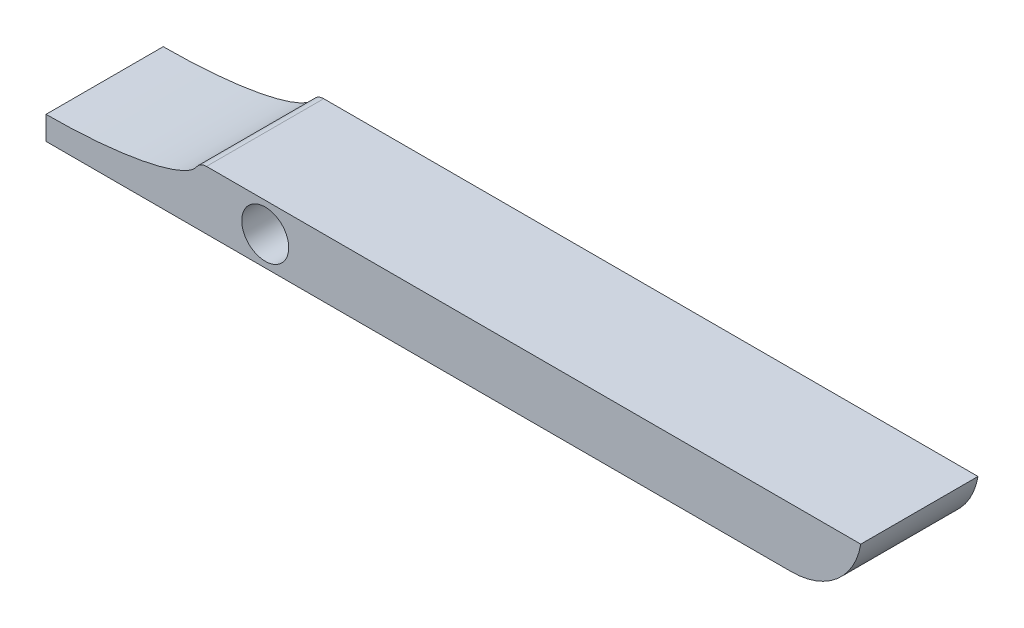
ISO-10303-21;
HEADER;
FILE_DESCRIPTION(('STEP AP214'),'2;1');
FILE_NAME('part.step','',(''),(''),'','','');
FILE_SCHEMA(('AUTOMOTIVE_DESIGN { 1 0 10303 214 1 1 1 1 }'));
ENDSEC;
DATA;
#1=APPLICATION_CONTEXT('core data for automotive mechanical design processes');
#2=APPLICATION_PROTOCOL_DEFINITION('international standard','automotive_design',2000,#1);
#3=PRODUCT_CONTEXT('',#1,'mechanical');
#4=PRODUCT('Part','Part','',(#3));
#5=PRODUCT_RELATED_PRODUCT_CATEGORY('part','',(#4));
#6=PRODUCT_DEFINITION_FORMATION('','',#4);
#7=PRODUCT_DEFINITION_CONTEXT('part definition',#1,'design');
#8=PRODUCT_DEFINITION('design','',#6,#7);
#9=PRODUCT_DEFINITION_SHAPE('','',#8);
#10=(LENGTH_UNIT() NAMED_UNIT(*) SI_UNIT(.MILLI.,.METRE.));
#11=(NAMED_UNIT(*) PLANE_ANGLE_UNIT() SI_UNIT($,.RADIAN.));
#12=(NAMED_UNIT(*) SI_UNIT($,.STERADIAN.) SOLID_ANGLE_UNIT());
#13=UNCERTAINTY_MEASURE_WITH_UNIT(LENGTH_MEASURE(1.E-05),#10,'distance_accuracy_value','');
#14=(GEOMETRIC_REPRESENTATION_CONTEXT(3) GLOBAL_UNCERTAINTY_ASSIGNED_CONTEXT((#13)) GLOBAL_UNIT_ASSIGNED_CONTEXT((#10,
#11,#12)) REPRESENTATION_CONTEXT('',''));
#15=CARTESIAN_POINT('',(0.,0.,0.));
#16=DIRECTION('',(0.,0.,1.));
#17=DIRECTION('',(1.,0.,0.));
#18=AXIS2_PLACEMENT_3D('',#15,#16,#17);
#19=CARTESIAN_POINT('',(-17.375,2.5,2.5));
#20=DIRECTION('',(1.,0.,0.));
#21=DIRECTION('',(0.,0.,-1.));
#22=AXIS2_PLACEMENT_3D('',#19,#20,#21);
#23=PLANE('',#22);
#24=DIRECTION('',(0.,-1.,0.));
#25=VECTOR('',#24,1.);
#26=CARTESIAN_POINT('',(-17.375,2.5,2.5));
#27=LINE('',#26,#25);
#28=CARTESIAN_POINT('',(-17.375,1.,2.5));
#29=VERTEX_POINT('',#28);
#30=CARTESIAN_POINT('',(-17.375,0.,2.5));
#31=VERTEX_POINT('',#30);
#32=EDGE_CURVE('E108',#29,#31,#27,.T.);
#33=ORIENTED_EDGE('',*,*,#32,.F.);
#34=DIRECTION('',(0.,0.,1.));
#35=VECTOR('',#34,1.);
#36=CARTESIAN_POINT('',(-17.375,1.,-7.5));
#37=LINE('',#36,#35);
#38=CARTESIAN_POINT('',(-17.375,1.,-2.5));
#39=VERTEX_POINT('',#38);
#40=EDGE_CURVE('E91',#29,#39,#37,.F.);
#41=ORIENTED_EDGE('',*,*,#40,.T.);
#42=DIRECTION('',(0.,-1.,0.));
#43=VECTOR('',#42,1.);
#44=CARTESIAN_POINT('',(-17.375,2.5,-2.5));
#45=LINE('',#44,#43);
#46=CARTESIAN_POINT('',(-17.375,0.,-2.5));
#47=VERTEX_POINT('',#46);
#48=EDGE_CURVE('E119',#39,#47,#45,.T.);
#49=ORIENTED_EDGE('',*,*,#48,.T.);
#50=DIRECTION('',(0.,0.,1.));
#51=VECTOR('',#50,1.);
#52=CARTESIAN_POINT('',(-17.375,0.,2.5));
#53=LINE('',#52,#51);
#54=EDGE_CURVE('E116',#47,#31,#53,.T.);
#55=ORIENTED_EDGE('',*,*,#54,.T.);
#56=EDGE_LOOP('',(#33,#41,#49,#55));
#57=FACE_BOUND('',#56,.T.);
#58=ADVANCED_FACE('F38',(#57),#23,.F.);
#59=CARTESIAN_POINT('',(17.375,2.5,2.5));
#60=DIRECTION('',(0.,0.,-1.));
#61=DIRECTION('',(-1.,0.,0.));
#62=AXIS2_PLACEMENT_3D('',#59,#60,#61);
#63=PLANE('',#62);
#64=CARTESIAN_POINT('',(-8.02499999999999,1.25,2.5));
#65=DIRECTION('',(0.,0.,1.));
#66=DIRECTION('',(1.,0.,0.));
#67=AXIS2_PLACEMENT_3D('',#64,#65,#66);
#68=CIRCLE('',#67,1.00249999999999);
#69=CARTESIAN_POINT('',(-7.0225,1.25,2.5));
#70=VERTEX_POINT('',#69);
#71=EDGE_CURVE('E104',#70,#70,#68,.T.);
#72=ORIENTED_EDGE('',*,*,#71,.F.);
#73=EDGE_LOOP('',(#72));
#74=FACE_BOUND('',#73,.T.);
#75=DIRECTION('',(1.,0.,0.));
#76=VECTOR('',#75,1.);
#77=CARTESIAN_POINT('',(17.375,0.,2.5));
#78=LINE('',#77,#76);
#79=CARTESIAN_POINT('',(14.4169601084502,0.,2.5));
#80=VERTEX_POINT('',#79);
#81=EDGE_CURVE('E171',#31,#80,#78,.T.);
#82=ORIENTED_EDGE('',*,*,#81,.T.);
#83=CARTESIAN_POINT('',(14.4169601084502,3.,2.5));
#84=DIRECTION('',(0.,0.,-1.));
#85=DIRECTION('',(-1.,0.,0.));
#86=AXIS2_PLACEMENT_3D('',#83,#84,#85);
#87=CIRCLE('',#86,3.);
#88=CARTESIAN_POINT('',(17.375,2.5,2.5));
#89=VERTEX_POINT('',#88);
#90=EDGE_CURVE('E11',#80,#89,#87,.F.);
#91=ORIENTED_EDGE('',*,*,#90,.T.);
#92=DIRECTION('',(1.,0.,0.));
#93=VECTOR('',#92,1.);
#94=CARTESIAN_POINT('',(17.375,2.5,2.5));
#95=LINE('',#94,#93);
#96=CARTESIAN_POINT('',(-10.5309585977544,2.5,2.5));
#97=VERTEX_POINT('',#96);
#98=EDGE_CURVE('E144',#97,#89,#95,.T.);
#99=ORIENTED_EDGE('',*,*,#98,.F.);
#100=CARTESIAN_POINT('',(-10.5309585977544,2.,2.5));
#101=DIRECTION('',(0.,0.,-1.));
#102=DIRECTION('',(-1.,0.,0.));
#103=AXIS2_PLACEMENT_3D('',#100,#101,#102);
#104=CIRCLE('',#103,0.5);
#105=CARTESIAN_POINT('',(-10.9486551771746,2.27482643166319,2.5));
#106=VERTEX_POINT('',#105);
#107=EDGE_CURVE('E111',#97,#106,#104,.F.);
#108=ORIENTED_EDGE('',*,*,#107,.T.);
#109=CARTESIAN_POINT('',(-17.375,2.5,2.5));
#110=DIRECTION('',(0.,0.,1.));
#111=DIRECTION('',(1.,0.,0.));
#112=AXIS2_PLACEMENT_3D('',#109,#110,#111);
#113=ELLIPSE('',#112,6.5,1.5);
#114=EDGE_CURVE('E95',#29,#106,#113,.T.);
#115=ORIENTED_EDGE('',*,*,#114,.F.);
#116=ORIENTED_EDGE('',*,*,#32,.T.);
#117=EDGE_LOOP('',(#82,#91,#99,#108,#115,#116));
#118=FACE_BOUND('',#117,.T.);
#119=ADVANCED_FACE('F107',(#74,#118),#63,.F.);
#120=CARTESIAN_POINT('',(17.375,2.5,-2.5));
#121=DIRECTION('',(0.,0.,1.));
#122=DIRECTION('',(1.,0.,0.));
#123=AXIS2_PLACEMENT_3D('',#120,#121,#122);
#124=PLANE('',#123);
#125=CARTESIAN_POINT('',(-8.02499999999999,1.25,-2.5));
#126=DIRECTION('',(0.,0.,1.));
#127=DIRECTION('',(1.,0.,0.));
#128=AXIS2_PLACEMENT_3D('',#125,#126,#127);
#129=CIRCLE('',#128,1.0025);
#130=CARTESIAN_POINT('',(-7.02249999999999,1.25,-2.5));
#131=VERTEX_POINT('',#130);
#132=EDGE_CURVE('E161',#131,#131,#129,.T.);
#133=ORIENTED_EDGE('',*,*,#132,.T.);
#134=EDGE_LOOP('',(#133));
#135=FACE_BOUND('',#134,.T.);
#136=DIRECTION('',(-1.,0.,0.));
#137=VECTOR('',#136,1.);
#138=CARTESIAN_POINT('',(17.375,2.5,-2.5));
#139=LINE('',#138,#137);
#140=CARTESIAN_POINT('',(17.375,2.5,-2.5));
#141=VERTEX_POINT('',#140);
#142=CARTESIAN_POINT('',(-10.5309585977544,2.5,-2.5));
#143=VERTEX_POINT('',#142);
#144=EDGE_CURVE('E125',#141,#143,#139,.T.);
#145=ORIENTED_EDGE('',*,*,#144,.F.);
#146=CARTESIAN_POINT('',(14.4169601084502,3.,-2.5));
#147=DIRECTION('',(0.,0.,1.));
#148=DIRECTION('',(1.,0.,0.));
#149=AXIS2_PLACEMENT_3D('',#146,#147,#148);
#150=CIRCLE('',#149,3.);
#151=CARTESIAN_POINT('',(14.4169601084502,0.,-2.5));
#152=VERTEX_POINT('',#151);
#153=EDGE_CURVE('E61',#141,#152,#150,.F.);
#154=ORIENTED_EDGE('',*,*,#153,.T.);
#155=DIRECTION('',(-1.,0.,0.));
#156=VECTOR('',#155,1.);
#157=CARTESIAN_POINT('',(17.375,0.,-2.5));
#158=LINE('',#157,#156);
#159=EDGE_CURVE('E150',#152,#47,#158,.T.);
#160=ORIENTED_EDGE('',*,*,#159,.T.);
#161=ORIENTED_EDGE('',*,*,#48,.F.);
#162=CARTESIAN_POINT('',(-17.375,2.5,-2.5));
#163=DIRECTION('',(0.,0.,1.));
#164=DIRECTION('',(1.,0.,0.));
#165=AXIS2_PLACEMENT_3D('',#162,#163,#164);
#166=ELLIPSE('',#165,6.5,1.5);
#167=CARTESIAN_POINT('',(-10.9486551771746,2.27482643166319,-2.5));
#168=VERTEX_POINT('',#167);
#169=EDGE_CURVE('E98',#39,#168,#166,.T.);
#170=ORIENTED_EDGE('',*,*,#169,.T.);
#171=CARTESIAN_POINT('',(-10.5309585977544,2.,-2.5));
#172=DIRECTION('',(0.,0.,1.));
#173=DIRECTION('',(1.,0.,0.));
#174=AXIS2_PLACEMENT_3D('',#171,#172,#173);
#175=CIRCLE('',#174,0.5);
#176=EDGE_CURVE('E123',#168,#143,#175,.F.);
#177=ORIENTED_EDGE('',*,*,#176,.T.);
#178=EDGE_LOOP('',(#145,#154,#160,#161,#170,#177));
#179=FACE_BOUND('',#178,.T.);
#180=ADVANCED_FACE('F153',(#135,#179),#124,.F.);
#181=CARTESIAN_POINT('',(0.,2.5,0.));
#182=DIRECTION('',(0.,1.,0.));
#183=DIRECTION('',(0.,0.,1.));
#184=AXIS2_PLACEMENT_3D('',#181,#182,#183);
#185=PLANE('',#184);
#186=ORIENTED_EDGE('',*,*,#144,.T.);
#187=DIRECTION('',(0.,0.,-1.));
#188=VECTOR('',#187,1.);
#189=CARTESIAN_POINT('',(-10.5309585977544,2.5,2.5));
#190=LINE('',#189,#188);
#191=EDGE_CURVE('E131',#143,#97,#190,.F.);
#192=ORIENTED_EDGE('',*,*,#191,.T.);
#193=ORIENTED_EDGE('',*,*,#98,.T.);
#194=DIRECTION('',(0.,0.,-1.));
#195=VECTOR('',#194,1.);
#196=CARTESIAN_POINT('',(17.375,2.5,2.5));
#197=LINE('',#196,#195);
#198=EDGE_CURVE('E149',#89,#141,#197,.T.);
#199=ORIENTED_EDGE('',*,*,#198,.T.);
#200=EDGE_LOOP('',(#186,#192,#193,#199));
#201=FACE_BOUND('',#200,.T.);
#202=ADVANCED_FACE('F142',(#201),#185,.T.);
#203=CARTESIAN_POINT('',(0.,0.,0.));
#204=DIRECTION('',(0.,1.,0.));
#205=DIRECTION('',(0.,0.,1.));
#206=AXIS2_PLACEMENT_3D('',#203,#204,#205);
#207=PLANE('',#206);
#208=ORIENTED_EDGE('',*,*,#159,.F.);
#209=DIRECTION('',(0.,0.,-1.));
#210=VECTOR('',#209,1.);
#211=CARTESIAN_POINT('',(14.4169601084502,0.,0.));
#212=LINE('',#211,#210);
#213=EDGE_CURVE('E47',#152,#80,#212,.F.);
#214=ORIENTED_EDGE('',*,*,#213,.T.);
#215=ORIENTED_EDGE('',*,*,#81,.F.);
#216=ORIENTED_EDGE('',*,*,#54,.F.);
#217=EDGE_LOOP('',(#208,#214,#215,#216));
#218=FACE_BOUND('',#217,.T.);
#219=ADVANCED_FACE('F174',(#218),#207,.F.);
#220=CARTESIAN_POINT('',(-8.02499999999999,1.25,2.5));
#221=DIRECTION('',(0.,0.,1.));
#222=DIRECTION('',(1.,0.,0.));
#223=AXIS2_PLACEMENT_3D('',#220,#221,#222);
#224=CYLINDRICAL_SURFACE('',#223,1.00249999999999);
#225=ORIENTED_EDGE('',*,*,#132,.F.);
#226=EDGE_LOOP('',(#225));
#227=FACE_BOUND('',#226,.T.);
#228=ORIENTED_EDGE('',*,*,#71,.T.);
#229=EDGE_LOOP('',(#228));
#230=FACE_BOUND('',#229,.T.);
#231=ADVANCED_FACE('F195',(#227,#230),#224,.F.);
#232=CARTESIAN_POINT('',(-17.375,2.5,-7.5));
#233=DIRECTION('',(0.,0.,1.));
#234=DIRECTION('',(1.,0.,0.));
#235=AXIS2_PLACEMENT_3D('',#232,#233,#234);
#236=ELLIPSE('',#235,6.5,1.5);
#237=DIRECTION('',(0.,0.,1.));
#238=VECTOR('',#237,1.);
#239=SURFACE_OF_LINEAR_EXTRUSION('',#236,#238);
#240=ORIENTED_EDGE('',*,*,#114,.T.);
#241=DIRECTION('',(0.,0.,1.));
#242=VECTOR('',#241,1.);
#243=CARTESIAN_POINT('',(-10.9486551771746,2.27482643166319,2.5));
#244=LINE('',#243,#242);
#245=EDGE_CURVE('E118',#106,#168,#244,.F.);
#246=ORIENTED_EDGE('',*,*,#245,.T.);
#247=ORIENTED_EDGE('',*,*,#169,.F.);
#248=ORIENTED_EDGE('',*,*,#40,.F.);
#249=EDGE_LOOP('',(#240,#246,#247,#248));
#250=FACE_BOUND('',#249,.T.);
#251=ADVANCED_FACE('F93',(#250),#239,.F.);
#252=CARTESIAN_POINT('',(-10.5309585977544,2.,0.));
#253=DIRECTION('',(0.,0.,1.));
#254=DIRECTION('',(1.,0.,0.));
#255=AXIS2_PLACEMENT_3D('',#252,#253,#254);
#256=CYLINDRICAL_SURFACE('',#255,0.5);
#257=ORIENTED_EDGE('',*,*,#107,.F.);
#258=ORIENTED_EDGE('',*,*,#191,.F.);
#259=ORIENTED_EDGE('',*,*,#176,.F.);
#260=ORIENTED_EDGE('',*,*,#245,.F.);
#261=EDGE_LOOP('',(#257,#258,#259,#260));
#262=FACE_BOUND('',#261,.T.);
#263=ADVANCED_FACE('F152',(#262),#256,.T.);
#264=CARTESIAN_POINT('',(14.4169601084502,3.,2.5));
#265=DIRECTION('',(0.,0.,-1.));
#266=DIRECTION('',(-1.,0.,0.));
#267=AXIS2_PLACEMENT_3D('',#264,#265,#266);
#268=CYLINDRICAL_SURFACE('',#267,3.);
#269=ORIENTED_EDGE('',*,*,#90,.F.);
#270=ORIENTED_EDGE('',*,*,#213,.F.);
#271=ORIENTED_EDGE('',*,*,#153,.F.);
#272=ORIENTED_EDGE('',*,*,#198,.F.);
#273=EDGE_LOOP('',(#269,#270,#271,#272));
#274=FACE_BOUND('',#273,.T.);
#275=ADVANCED_FACE('F40',(#274),#268,.T.);
#276=CLOSED_SHELL('',(#58,#119,#180,#202,#219,#231,#251,#263,#275));
#277=MANIFOLD_SOLID_BREP('B2',#276);
#278=ADVANCED_BREP_SHAPE_REPRESENTATION('',(#18,#277),#14);
#279=SHAPE_DEFINITION_REPRESENTATION(#9,#278);
ENDSEC;
END-ISO-10303-21;
